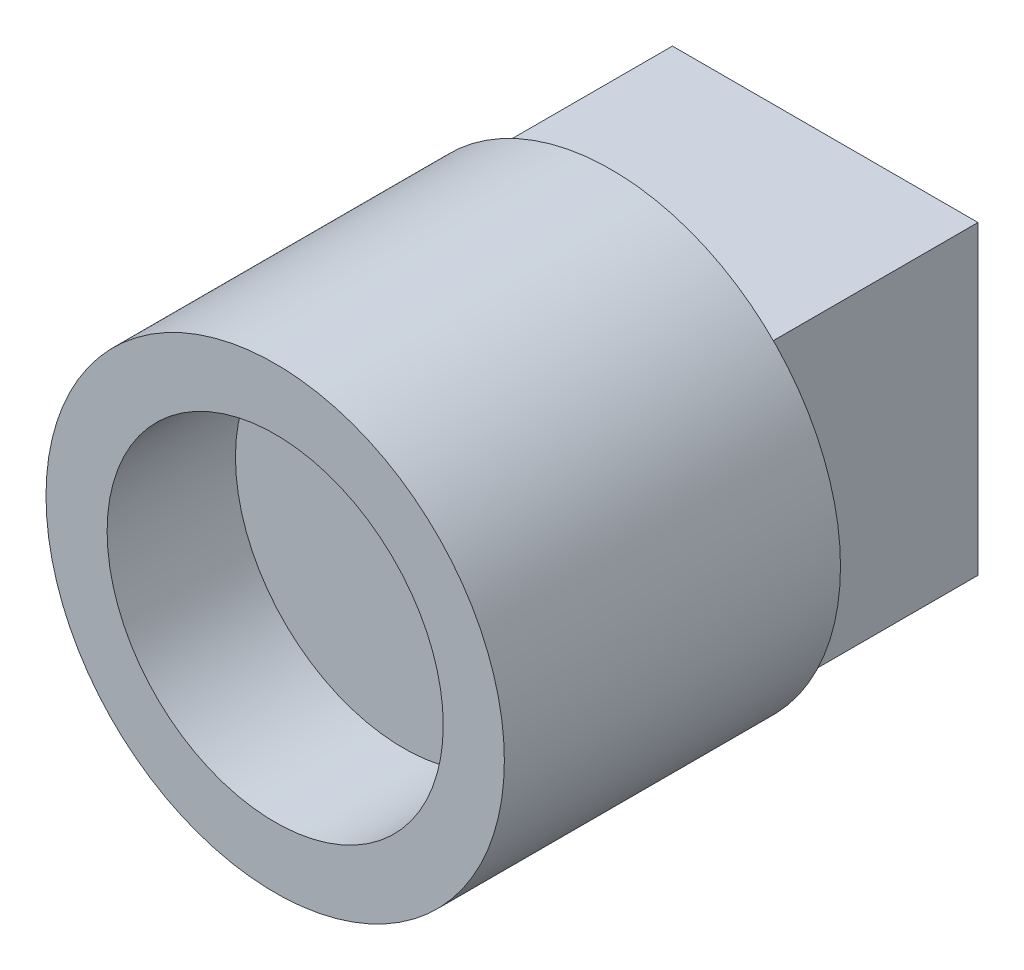
ISO-10303-21;
HEADER;
FILE_DESCRIPTION(('STEP AP214'),'2;1');
FILE_NAME('part.step','',(''),(''),'','','');
FILE_SCHEMA(('AUTOMOTIVE_DESIGN { 1 0 10303 214 1 1 1 1 }'));
ENDSEC;
DATA;
#1=APPLICATION_CONTEXT('core data for automotive mechanical design processes');
#2=APPLICATION_PROTOCOL_DEFINITION('international standard','automotive_design',2000,#1);
#3=PRODUCT_CONTEXT('',#1,'mechanical');
#4=PRODUCT('Part','Part','',(#3));
#5=PRODUCT_RELATED_PRODUCT_CATEGORY('part','',(#4));
#6=PRODUCT_DEFINITION_FORMATION('','',#4);
#7=PRODUCT_DEFINITION_CONTEXT('part definition',#1,'design');
#8=PRODUCT_DEFINITION('design','',#6,#7);
#9=PRODUCT_DEFINITION_SHAPE('','',#8);
#10=(LENGTH_UNIT() NAMED_UNIT(*) SI_UNIT(.MILLI.,.METRE.));
#11=(NAMED_UNIT(*) PLANE_ANGLE_UNIT() SI_UNIT($,.RADIAN.));
#12=(NAMED_UNIT(*) SI_UNIT($,.STERADIAN.) SOLID_ANGLE_UNIT());
#13=UNCERTAINTY_MEASURE_WITH_UNIT(LENGTH_MEASURE(1.E-05),#10,'distance_accuracy_value','');
#14=(GEOMETRIC_REPRESENTATION_CONTEXT(3) GLOBAL_UNCERTAINTY_ASSIGNED_CONTEXT((#13)) GLOBAL_UNIT_ASSIGNED_CONTEXT((#10,
#11,#12)) REPRESENTATION_CONTEXT('',''));
#15=CARTESIAN_POINT('',(0.,0.,0.));
#16=DIRECTION('',(0.,0.,1.));
#17=DIRECTION('',(1.,0.,0.));
#18=AXIS2_PLACEMENT_3D('',#15,#16,#17);
#19=CARTESIAN_POINT('',(0.,0.,110.));
#20=DIRECTION('',(0.,0.,-1.));
#21=DIRECTION('',(-1.,0.,0.));
#22=AXIS2_PLACEMENT_3D('',#19,#20,#21);
#23=CYLINDRICAL_SURFACE('',#22,75.);
#24=CARTESIAN_POINT('',(0.,0.,110.));
#25=DIRECTION('',(0.,0.,1.));
#26=DIRECTION('',(1.,0.,0.));
#27=AXIS2_PLACEMENT_3D('',#24,#25,#26);
#28=CIRCLE('',#27,75.);
#29=CARTESIAN_POINT('',(75.,0.,110.));
#30=VERTEX_POINT('',#29);
#31=EDGE_CURVE('E11',#30,#30,#28,.T.);
#32=ORIENTED_EDGE('',*,*,#31,.F.);
#33=EDGE_LOOP('',(#32));
#34=FACE_BOUND('',#33,.T.);
#35=CARTESIAN_POINT('',(0.,0.,0.));
#36=DIRECTION('',(0.,0.,1.));
#37=DIRECTION('',(1.,0.,0.));
#38=AXIS2_PLACEMENT_3D('',#35,#36,#37);
#39=CIRCLE('',#38,75.);
#40=CARTESIAN_POINT('',(75.,0.,0.));
#41=VERTEX_POINT('',#40);
#42=EDGE_CURVE('E37',#41,#41,#39,.T.);
#43=ORIENTED_EDGE('',*,*,#42,.T.);
#44=EDGE_LOOP('',(#43));
#45=FACE_BOUND('',#44,.T.);
#46=ADVANCED_FACE('F34',(#34,#45),#23,.T.);
#47=CARTESIAN_POINT('',(0.,0.,110.));
#48=DIRECTION('',(0.,0.,1.));
#49=DIRECTION('',(1.,0.,0.));
#50=AXIS2_PLACEMENT_3D('',#47,#48,#49);
#51=PLANE('',#50);
#52=CARTESIAN_POINT('',(0.,0.,110.));
#53=DIRECTION('',(0.,0.,1.));
#54=DIRECTION('',(1.,0.,0.));
#55=AXIS2_PLACEMENT_3D('',#52,#53,#54);
#56=CIRCLE('',#55,55.);
#57=CARTESIAN_POINT('',(55.,0.,110.));
#58=VERTEX_POINT('',#57);
#59=EDGE_CURVE('E99',#58,#58,#56,.T.);
#60=ORIENTED_EDGE('',*,*,#59,.F.);
#61=EDGE_LOOP('',(#60));
#62=FACE_BOUND('',#61,.T.);
#63=ORIENTED_EDGE('',*,*,#31,.T.);
#64=EDGE_LOOP('',(#63));
#65=FACE_BOUND('',#64,.T.);
#66=ADVANCED_FACE('F130',(#62,#65),#51,.T.);
#67=CARTESIAN_POINT('',(0.,0.,0.));
#68=DIRECTION('',(0.,0.,1.));
#69=DIRECTION('',(1.,0.,0.));
#70=AXIS2_PLACEMENT_3D('',#67,#68,#69);
#71=PLANE('',#70);
#72=DIRECTION('',(1.,0.,0.));
#73=VECTOR('',#72,1.);
#74=CARTESIAN_POINT('',(-50.,50.,0.));
#75=LINE('',#74,#73);
#76=CARTESIAN_POINT('',(-50.,50.,0.));
#77=VERTEX_POINT('',#76);
#78=CARTESIAN_POINT('',(50.,50.,0.));
#79=VERTEX_POINT('',#78);
#80=EDGE_CURVE('E93',#77,#79,#75,.T.);
#81=ORIENTED_EDGE('',*,*,#80,.F.);
#82=DIRECTION('',(0.,-1.,0.));
#83=VECTOR('',#82,1.);
#84=CARTESIAN_POINT('',(-50.,50.,0.));
#85=LINE('',#84,#83);
#86=CARTESIAN_POINT('',(-50.,-50.,0.));
#87=VERTEX_POINT('',#86);
#88=EDGE_CURVE('E48',#77,#87,#85,.T.);
#89=ORIENTED_EDGE('',*,*,#88,.T.);
#90=DIRECTION('',(1.,0.,0.));
#91=VECTOR('',#90,1.);
#92=CARTESIAN_POINT('',(-50.,-50.,0.));
#93=LINE('',#92,#91);
#94=CARTESIAN_POINT('',(50.,-50.,0.));
#95=VERTEX_POINT('',#94);
#96=EDGE_CURVE('E53',#87,#95,#93,.T.);
#97=ORIENTED_EDGE('',*,*,#96,.T.);
#98=DIRECTION('',(0.,-1.,0.));
#99=VECTOR('',#98,1.);
#100=CARTESIAN_POINT('',(50.,50.,0.));
#101=LINE('',#100,#99);
#102=EDGE_CURVE('E96',#79,#95,#101,.T.);
#103=ORIENTED_EDGE('',*,*,#102,.F.);
#104=EDGE_LOOP('',(#81,#89,#97,#103));
#105=FACE_BOUND('',#104,.T.);
#106=ORIENTED_EDGE('',*,*,#42,.F.);
#107=EDGE_LOOP('',(#106));
#108=FACE_BOUND('',#107,.T.);
#109=ADVANCED_FACE('F116',(#105,#108),#71,.F.);
#110=CARTESIAN_POINT('',(-50.,50.,-70.));
#111=DIRECTION('',(-1.,0.,0.));
#112=DIRECTION('',(0.,-1.,0.));
#113=AXIS2_PLACEMENT_3D('',#110,#111,#112);
#114=PLANE('',#113);
#115=ORIENTED_EDGE('',*,*,#88,.F.);
#116=DIRECTION('',(0.,0.,1.));
#117=VECTOR('',#116,1.);
#118=CARTESIAN_POINT('',(-50.,50.,-70.));
#119=LINE('',#118,#117);
#120=CARTESIAN_POINT('',(-50.,50.,-70.));
#121=VERTEX_POINT('',#120);
#122=EDGE_CURVE('E91',#121,#77,#119,.T.);
#123=ORIENTED_EDGE('',*,*,#122,.F.);
#124=DIRECTION('',(0.,-1.,0.));
#125=VECTOR('',#124,1.);
#126=CARTESIAN_POINT('',(-50.,50.,-70.));
#127=LINE('',#126,#125);
#128=CARTESIAN_POINT('',(-50.,-50.,-70.));
#129=VERTEX_POINT('',#128);
#130=EDGE_CURVE('E84',#121,#129,#127,.T.);
#131=ORIENTED_EDGE('',*,*,#130,.T.);
#132=DIRECTION('',(0.,0.,1.));
#133=VECTOR('',#132,1.);
#134=CARTESIAN_POINT('',(-50.,-50.,-70.));
#135=LINE('',#134,#133);
#136=EDGE_CURVE('E72',#129,#87,#135,.T.);
#137=ORIENTED_EDGE('',*,*,#136,.T.);
#138=EDGE_LOOP('',(#115,#123,#131,#137));
#139=FACE_BOUND('',#138,.T.);
#140=ADVANCED_FACE('F89',(#139),#114,.T.);
#141=CARTESIAN_POINT('',(-50.,50.,-70.));
#142=DIRECTION('',(0.,-1.,0.));
#143=DIRECTION('',(1.,0.,0.));
#144=AXIS2_PLACEMENT_3D('',#141,#142,#143);
#145=PLANE('',#144);
#146=ORIENTED_EDGE('',*,*,#80,.T.);
#147=DIRECTION('',(0.,0.,1.));
#148=VECTOR('',#147,1.);
#149=CARTESIAN_POINT('',(50.,50.,-70.));
#150=LINE('',#149,#148);
#151=CARTESIAN_POINT('',(50.,50.,-70.));
#152=VERTEX_POINT('',#151);
#153=EDGE_CURVE('E110',#152,#79,#150,.T.);
#154=ORIENTED_EDGE('',*,*,#153,.F.);
#155=DIRECTION('',(1.,0.,0.));
#156=VECTOR('',#155,1.);
#157=CARTESIAN_POINT('',(-50.,50.,-70.));
#158=LINE('',#157,#156);
#159=EDGE_CURVE('E79',#121,#152,#158,.T.);
#160=ORIENTED_EDGE('',*,*,#159,.F.);
#161=ORIENTED_EDGE('',*,*,#122,.T.);
#162=EDGE_LOOP('',(#146,#154,#160,#161));
#163=FACE_BOUND('',#162,.T.);
#164=ADVANCED_FACE('F119',(#163),#145,.F.);
#165=CARTESIAN_POINT('',(50.,50.,-70.));
#166=DIRECTION('',(-1.,0.,0.));
#167=DIRECTION('',(0.,-1.,0.));
#168=AXIS2_PLACEMENT_3D('',#165,#166,#167);
#169=PLANE('',#168);
#170=ORIENTED_EDGE('',*,*,#102,.T.);
#171=DIRECTION('',(0.,0.,1.));
#172=VECTOR('',#171,1.);
#173=CARTESIAN_POINT('',(50.,-50.,-70.));
#174=LINE('',#173,#172);
#175=CARTESIAN_POINT('',(50.,-50.,-70.));
#176=VERTEX_POINT('',#175);
#177=EDGE_CURVE('E78',#176,#95,#174,.T.);
#178=ORIENTED_EDGE('',*,*,#177,.F.);
#179=DIRECTION('',(0.,-1.,0.));
#180=VECTOR('',#179,1.);
#181=CARTESIAN_POINT('',(50.,50.,-70.));
#182=LINE('',#181,#180);
#183=EDGE_CURVE('E86',#152,#176,#182,.T.);
#184=ORIENTED_EDGE('',*,*,#183,.F.);
#185=ORIENTED_EDGE('',*,*,#153,.T.);
#186=EDGE_LOOP('',(#170,#178,#184,#185));
#187=FACE_BOUND('',#186,.T.);
#188=ADVANCED_FACE('F114',(#187),#169,.F.);
#189=CARTESIAN_POINT('',(-50.,-50.,-70.));
#190=DIRECTION('',(0.,-1.,0.));
#191=DIRECTION('',(1.,0.,0.));
#192=AXIS2_PLACEMENT_3D('',#189,#190,#191);
#193=PLANE('',#192);
#194=ORIENTED_EDGE('',*,*,#96,.F.);
#195=ORIENTED_EDGE('',*,*,#136,.F.);
#196=DIRECTION('',(1.,0.,0.));
#197=VECTOR('',#196,1.);
#198=CARTESIAN_POINT('',(-50.,-50.,-70.));
#199=LINE('',#198,#197);
#200=EDGE_CURVE('E75',#129,#176,#199,.T.);
#201=ORIENTED_EDGE('',*,*,#200,.T.);
#202=ORIENTED_EDGE('',*,*,#177,.T.);
#203=EDGE_LOOP('',(#194,#195,#201,#202));
#204=FACE_BOUND('',#203,.T.);
#205=ADVANCED_FACE('F74',(#204),#193,.T.);
#206=CARTESIAN_POINT('',(0.,0.,-70.));
#207=DIRECTION('',(0.,0.,1.));
#208=DIRECTION('',(1.,0.,0.));
#209=AXIS2_PLACEMENT_3D('',#206,#207,#208);
#210=PLANE('',#209);
#211=ORIENTED_EDGE('',*,*,#130,.F.);
#212=ORIENTED_EDGE('',*,*,#159,.T.);
#213=ORIENTED_EDGE('',*,*,#183,.T.);
#214=ORIENTED_EDGE('',*,*,#200,.F.);
#215=EDGE_LOOP('',(#211,#212,#213,#214));
#216=FACE_BOUND('',#215,.T.);
#217=ADVANCED_FACE('F83',(#216),#210,.F.);
#218=CARTESIAN_POINT('',(0.,0.,68.));
#219=DIRECTION('',(0.,0.,1.));
#220=DIRECTION('',(1.,0.,0.));
#221=AXIS2_PLACEMENT_3D('',#218,#219,#220);
#222=CYLINDRICAL_SURFACE('',#221,55.);
#223=CARTESIAN_POINT('',(0.,0.,68.));
#224=DIRECTION('',(0.,0.,1.));
#225=DIRECTION('',(1.,0.,0.));
#226=AXIS2_PLACEMENT_3D('',#223,#224,#225);
#227=CIRCLE('',#226,55.);
#228=CARTESIAN_POINT('',(55.,0.,68.));
#229=VERTEX_POINT('',#228);
#230=EDGE_CURVE('E105',#229,#229,#227,.T.);
#231=CARTESIAN_POINT('',(55.,0.,68.));
#232=CARTESIAN_POINT('',(55.,0.,68.4375));
#233=CARTESIAN_POINT('',(55.,0.,68.875));
#234=CARTESIAN_POINT('',(55.,0.,69.75));
#235=CARTESIAN_POINT('',(55.,0.,70.1875));
#236=CARTESIAN_POINT('',(55.,0.,71.0625));
#237=CARTESIAN_POINT('',(55.,0.,71.5));
#238=CARTESIAN_POINT('',(55.,0.,72.375));
#239=CARTESIAN_POINT('',(55.,0.,72.8125));
#240=CARTESIAN_POINT('',(55.,0.,73.6875));
#241=CARTESIAN_POINT('',(55.,0.,74.125));
#242=CARTESIAN_POINT('',(55.,0.,75.));
#243=CARTESIAN_POINT('',(55.,0.,75.4375));
#244=CARTESIAN_POINT('',(55.,0.,76.3125));
#245=CARTESIAN_POINT('',(55.,0.,76.75));
#246=CARTESIAN_POINT('',(55.,0.,77.625));
#247=CARTESIAN_POINT('',(55.,0.,78.0625));
#248=CARTESIAN_POINT('',(55.,0.,78.9375));
#249=CARTESIAN_POINT('',(55.,0.,79.375));
#250=CARTESIAN_POINT('',(55.,0.,80.25));
#251=CARTESIAN_POINT('',(55.,0.,80.6875));
#252=CARTESIAN_POINT('',(55.,0.,81.5625));
#253=CARTESIAN_POINT('',(55.,0.,82.));
#254=CARTESIAN_POINT('',(55.,0.,82.875));
#255=CARTESIAN_POINT('',(55.,0.,83.3125));
#256=CARTESIAN_POINT('',(55.,0.,84.1875));
#257=CARTESIAN_POINT('',(55.,0.,84.625));
#258=CARTESIAN_POINT('',(55.,0.,85.5));
#259=CARTESIAN_POINT('',(55.,0.,85.9375));
#260=CARTESIAN_POINT('',(55.,0.,86.8125));
#261=CARTESIAN_POINT('',(55.,0.,87.25));
#262=CARTESIAN_POINT('',(55.,0.,88.125));
#263=CARTESIAN_POINT('',(55.,0.,88.5625));
#264=CARTESIAN_POINT('',(55.,0.,89.4375));
#265=CARTESIAN_POINT('',(55.,0.,89.875));
#266=CARTESIAN_POINT('',(55.,0.,90.75));
#267=CARTESIAN_POINT('',(55.,0.,91.1875));
#268=CARTESIAN_POINT('',(55.,0.,92.0625));
#269=CARTESIAN_POINT('',(55.,0.,92.5));
#270=CARTESIAN_POINT('',(55.,0.,93.375));
#271=CARTESIAN_POINT('',(55.,0.,93.8125));
#272=CARTESIAN_POINT('',(55.,0.,94.6875));
#273=CARTESIAN_POINT('',(55.,0.,95.125));
#274=CARTESIAN_POINT('',(55.,0.,96.));
#275=CARTESIAN_POINT('',(55.,0.,96.4375));
#276=CARTESIAN_POINT('',(55.,0.,97.3125));
#277=CARTESIAN_POINT('',(55.,0.,97.75));
#278=CARTESIAN_POINT('',(55.,0.,98.625));
#279=CARTESIAN_POINT('',(55.,0.,99.0625));
#280=CARTESIAN_POINT('',(55.,0.,99.9375));
#281=CARTESIAN_POINT('',(55.,0.,100.375));
#282=CARTESIAN_POINT('',(55.,0.,101.25));
#283=CARTESIAN_POINT('',(55.,0.,101.6875));
#284=CARTESIAN_POINT('',(55.,0.,102.5625));
#285=CARTESIAN_POINT('',(55.,0.,103.));
#286=CARTESIAN_POINT('',(55.,0.,103.875));
#287=CARTESIAN_POINT('',(55.,0.,104.3125));
#288=CARTESIAN_POINT('',(55.,0.,105.1875));
#289=CARTESIAN_POINT('',(55.,0.,105.625));
#290=CARTESIAN_POINT('',(55.,0.,106.5));
#291=CARTESIAN_POINT('',(55.,0.,106.9375));
#292=CARTESIAN_POINT('',(55.,0.,107.8125));
#293=CARTESIAN_POINT('',(55.,0.,108.25));
#294=CARTESIAN_POINT('',(55.,0.,109.125));
#295=CARTESIAN_POINT('',(55.,0.,109.5625));
#296=CARTESIAN_POINT('',(55.,0.,110.));
#297=B_SPLINE_CURVE_WITH_KNOTS('',3,(#231,#232,#233,#234,#235,#236,#237,#238,#239,#240,#241,
#242,#243,#244,#245,#246,#247,#248,#249,#250,#251,#252,#253,#254,#255,#256,#257,#258,#259,#260,
#261,#262,#263,#264,#265,#266,#267,#268,#269,#270,#271,#272,#273,#274,#275,#276,#277,#278,#279,
#280,#281,#282,#283,#284,#285,#286,#287,#288,#289,#290,#291,#292,#293,#294,#295,#296),
.UNSPECIFIED.,.F.,.F.,(4,2,2,2,2,2,2,2,2,2,2,2,2,2,2,2,2,2,2,2,2,2,2,2,2,2,2,2,2,2,2,2,4),(0.,
1.31249999999999,2.62499999999999,3.9375,5.24999999999999,6.5625,7.87499999999999,
9.18749999999999,10.5,11.8125,13.125,14.4375,15.75,17.0625,18.375,19.6875,21.,22.3125,23.625,
24.9375,26.25,27.5625,28.875,30.1875,31.5,32.8125,34.125,35.4375,36.75,38.0625,39.375,40.6875,
42.),.UNSPECIFIED.);
#298=EDGE_CURVE('BSEAM150',#229,#58,#297,.T.);
#299=ORIENTED_EDGE('',*,*,#230,.F.);
#300=ORIENTED_EDGE('',*,*,#59,.T.);
#301=ORIENTED_EDGE('',*,*,#298,.T.);
#302=ORIENTED_EDGE('',*,*,#298,.F.);
#303=EDGE_LOOP('',(#299,#301,#300,#302));
#304=FACE_BOUND('',#303,.T.);
#305=ADVANCED_FACE('F150',(#304),#222,.F.);
#306=CARTESIAN_POINT('',(0.,0.,68.));
#307=DIRECTION('',(0.,0.,1.));
#308=DIRECTION('',(1.,0.,0.));
#309=AXIS2_PLACEMENT_3D('',#306,#307,#308);
#310=PLANE('',#309);
#311=ORIENTED_EDGE('',*,*,#230,.T.);
#312=EDGE_LOOP('',(#311));
#313=FACE_BOUND('',#312,.T.);
#314=ADVANCED_FACE('F154',(#313),#310,.T.);
#315=CLOSED_SHELL('',(#46,#66,#109,#140,#164,#188,#205,#217,#305,#314));
#316=MANIFOLD_SOLID_BREP('B2',#315);
#317=ADVANCED_BREP_SHAPE_REPRESENTATION('',(#18,#316),#14);
#318=SHAPE_DEFINITION_REPRESENTATION(#9,#317);
ENDSEC;
END-ISO-10303-21;
